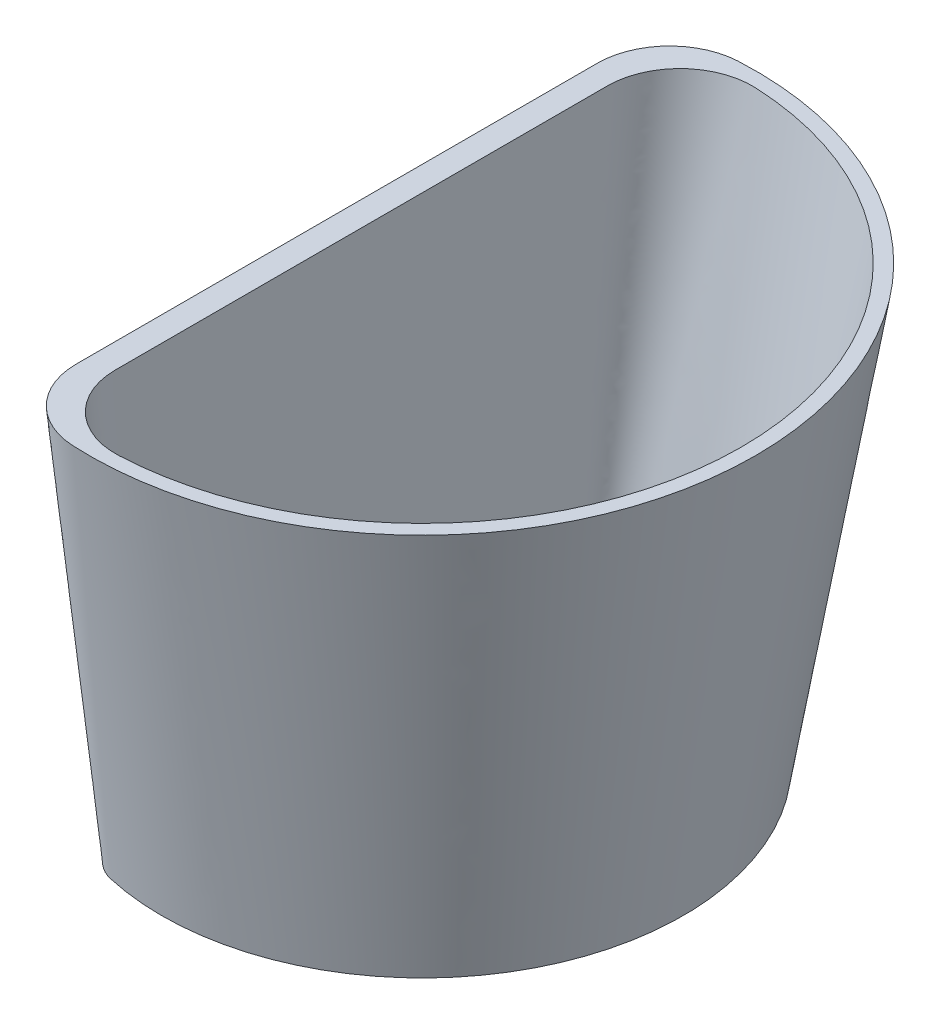
ISO-10303-21;
HEADER;
FILE_DESCRIPTION(('STEP AP214'),'2;1');
FILE_NAME('part.step','',(''),(''),'','','');
FILE_SCHEMA(('AUTOMOTIVE_DESIGN { 1 0 10303 214 1 1 1 1 }'));
ENDSEC;
DATA;
#1=APPLICATION_CONTEXT('core data for automotive mechanical design processes');
#2=APPLICATION_PROTOCOL_DEFINITION('international standard','automotive_design',2000,#1);
#3=PRODUCT_CONTEXT('',#1,'mechanical');
#4=PRODUCT('Part','Part','',(#3));
#5=PRODUCT_RELATED_PRODUCT_CATEGORY('part','',(#4));
#6=PRODUCT_DEFINITION_FORMATION('','',#4);
#7=PRODUCT_DEFINITION_CONTEXT('part definition',#1,'design');
#8=PRODUCT_DEFINITION('design','',#6,#7);
#9=PRODUCT_DEFINITION_SHAPE('','',#8);
#10=(LENGTH_UNIT() NAMED_UNIT(*) SI_UNIT(.MILLI.,.METRE.));
#11=(NAMED_UNIT(*) PLANE_ANGLE_UNIT() SI_UNIT($,.RADIAN.));
#12=(NAMED_UNIT(*) SI_UNIT($,.STERADIAN.) SOLID_ANGLE_UNIT());
#13=UNCERTAINTY_MEASURE_WITH_UNIT(LENGTH_MEASURE(1.E-05),#10,'distance_accuracy_value','');
#14=(GEOMETRIC_REPRESENTATION_CONTEXT(3) GLOBAL_UNCERTAINTY_ASSIGNED_CONTEXT((#13)) GLOBAL_UNIT_ASSIGNED_CONTEXT((#10,
#11,#12)) REPRESENTATION_CONTEXT('',''));
#15=CARTESIAN_POINT('',(0.,0.,0.));
#16=DIRECTION('',(0.,0.,1.));
#17=DIRECTION('',(1.,0.,0.));
#18=AXIS2_PLACEMENT_3D('',#15,#16,#17);
#19=CARTESIAN_POINT('',(44.749368056954,0.,74.8623568739464));
#20=DIRECTION('',(0.,-1.,0.));
#21=DIRECTION('',(0.,0.,-1.));
#22=AXIS2_PLACEMENT_3D('',#19,#20,#21);
#23=PLANE('',#22);
#24=DIRECTION('',(0.,0.,-1.));
#25=VECTOR('',#24,1.);
#26=CARTESIAN_POINT('',(43.1553778499769,0.,74.7241580024169));
#27=LINE('',#26,#25);
#28=CARTESIAN_POINT('',(43.1553778499769,0.,74.7241580024169));
#29=VERTEX_POINT('',#28);
#30=CARTESIAN_POINT('',(43.1553778499769,0.,14.5250534106629));
#31=VERTEX_POINT('',#30);
#32=EDGE_CURVE('E294',#29,#31,#27,.T.);
#33=ORIENTED_EDGE('',*,*,#32,.F.);
#34=CARTESIAN_POINT('',(46.6553778499769,0.,74.7241580024169));
#35=DIRECTION('',(0.,1.,0.));
#36=DIRECTION('',(0.,0.,1.));
#37=AXIS2_PLACEMENT_3D('',#34,#35,#36);
#38=CIRCLE('',#37,3.5);
#39=CARTESIAN_POINT('',(46.0900819743665,0.,78.1782049871897));
#40=VERTEX_POINT('',#39);
#41=EDGE_CURVE('E290',#29,#40,#38,.T.);
#42=ORIENTED_EDGE('',*,*,#41,.T.);
#43=CARTESIAN_POINT('',(51.5815276231532,0.,44.6246057065399));
#44=DIRECTION('',(0.,1.,0.));
#45=DIRECTION('',(0.,0.,1.));
#46=AXIS2_PLACEMENT_3D('',#43,#44,#45);
#47=CIRCLE('',#46,34.);
#48=CARTESIAN_POINT('',(46.0900819743665,0.,11.0710064258901));
#49=VERTEX_POINT('',#48);
#50=EDGE_CURVE('E229',#40,#49,#47,.T.);
#51=ORIENTED_EDGE('',*,*,#50,.T.);
#52=CARTESIAN_POINT('',(46.6553778499769,0.,14.5250534106629));
#53=DIRECTION('',(0.,1.,0.));
#54=DIRECTION('',(0.,0.,1.));
#55=AXIS2_PLACEMENT_3D('',#52,#53,#54);
#56=CIRCLE('',#55,3.5);
#57=EDGE_CURVE('E304',#49,#31,#56,.T.);
#58=ORIENTED_EDGE('',*,*,#57,.T.);
#59=EDGE_LOOP('',(#33,#42,#51,#58));
#60=FACE_BOUND('',#59,.T.);
#61=CARTESIAN_POINT('',(44.749368056954,0.,74.8623568739464));
#62=DIRECTION('',(0.,-1.,0.));
#63=DIRECTION('',(0.,0.,-1.));
#64=AXIS2_PLACEMENT_3D('',#61,#62,#63);
#65=CIRCLE('',#64,4.99999999999999);
#66=CARTESIAN_POINT('',(43.6474068365993,0.,79.7394135138506));
#67=VERTEX_POINT('',#66);
#68=CARTESIAN_POINT('',(39.749368056954,0.,74.8623568740552));
#69=VERTEX_POINT('',#68);
#70=EDGE_CURVE('E470',#67,#69,#65,.T.);
#71=ORIENTED_EDGE('',*,*,#70,.T.);
#72=DIRECTION('',(0.,0.,-1.));
#73=VECTOR('',#72,1.);
#74=CARTESIAN_POINT('',(39.749368056954,0.,74.8623568739464));
#75=LINE('',#74,#73);
#76=CARTESIAN_POINT('',(39.749368056954,0.,14.3868545392133));
#77=VERTEX_POINT('',#76);
#78=EDGE_CURVE('E471',#69,#77,#75,.T.);
#79=ORIENTED_EDGE('',*,*,#78,.T.);
#80=CARTESIAN_POINT('',(44.749368056954,0.,14.3868545391334));
#81=DIRECTION('',(0.,-1.,0.));
#82=DIRECTION('',(0.,0.,-1.));
#83=AXIS2_PLACEMENT_3D('',#80,#81,#82);
#84=CIRCLE('',#83,5.);
#85=CARTESIAN_POINT('',(43.6474068365993,0.,9.50979789922914));
#86=VERTEX_POINT('',#85);
#87=EDGE_CURVE('E235',#77,#86,#84,.T.);
#88=ORIENTED_EDGE('',*,*,#87,.T.);
#89=CARTESIAN_POINT('',(51.5815276231532,0.,44.6246057065399));
#90=DIRECTION('',(0.,1.,0.));
#91=DIRECTION('',(0.,0.,1.));
#92=AXIS2_PLACEMENT_3D('',#89,#90,#91);
#93=CIRCLE('',#92,36.);
#94=EDGE_CURVE('E12',#67,#86,#93,.T.);
#95=ORIENTED_EDGE('',*,*,#94,.F.);
#96=EDGE_LOOP('',(#71,#79,#88,#95));
#97=FACE_BOUND('',#96,.T.);
#98=ADVANCED_FACE('F225',(#60,#97),#23,.T.);
#99=CARTESIAN_POINT('',(49.749368056954,60.,8.671258277907));
#100=DIRECTION('',(0.,-1.,0.));
#101=DIRECTION('',(0.,0.,-1.));
#102=AXIS2_PLACEMENT_3D('',#99,#100,#101);
#103=PLANE('',#102);
#104=CARTESIAN_POINT('',(53.1553778499769,60.,78.5881596351783));
#105=DIRECTION('',(0.,-1.,0.));
#106=DIRECTION('',(0.,0.,-1.));
#107=AXIS2_PLACEMENT_3D('',#104,#105,#106);
#108=CIRCLE('',#107,10.);
#109=CARTESIAN_POINT('',(53.6182749755133,60.,88.5774402024248));
#110=VERTEX_POINT('',#109);
#111=CARTESIAN_POINT('',(43.1553778499769,60.,78.5881596334264));
#112=VERTEX_POINT('',#111);
#113=EDGE_CURVE('E306',#110,#112,#108,.T.);
#114=ORIENTED_EDGE('',*,*,#113,.T.);
#115=DIRECTION('',(0.,0.,-1.));
#116=VECTOR('',#115,1.);
#117=CARTESIAN_POINT('',(43.1553778499769,60.,78.5881596351783));
#118=LINE('',#117,#116);
#119=CARTESIAN_POINT('',(43.1553778499769,60.,10.6610517779015));
#120=VERTEX_POINT('',#119);
#121=EDGE_CURVE('E251',#112,#120,#118,.T.);
#122=ORIENTED_EDGE('',*,*,#121,.T.);
#123=CARTESIAN_POINT('',(53.1553778499769,60.,10.6610517779015));
#124=DIRECTION('',(0.,-1.,0.));
#125=DIRECTION('',(0.,0.,-1.));
#126=AXIS2_PLACEMENT_3D('',#123,#124,#125);
#127=CIRCLE('',#126,10.);
#128=CARTESIAN_POINT('',(53.6182749755133,60.,0.671771210654943));
#129=VERTEX_POINT('',#128);
#130=EDGE_CURVE('E332',#120,#129,#127,.T.);
#131=ORIENTED_EDGE('',*,*,#130,.T.);
#132=CARTESIAN_POINT('',(51.5815276231532,60.,44.6246057065399));
#133=DIRECTION('',(0.,1.,0.));
#134=DIRECTION('',(0.,0.,1.));
#135=AXIS2_PLACEMENT_3D('',#132,#133,#134);
#136=CIRCLE('',#135,44.);
#137=EDGE_CURVE('E322',#110,#129,#136,.T.);
#138=ORIENTED_EDGE('',*,*,#137,.F.);
#139=EDGE_LOOP('',(#114,#122,#131,#138));
#140=FACE_BOUND('',#139,.T.);
#141=CARTESIAN_POINT('',(49.749368056954,60.,8.671258277907));
#142=DIRECTION('',(0.,-1.,0.));
#143=DIRECTION('',(0.,0.,-1.));
#144=AXIS2_PLACEMENT_3D('',#141,#142,#143);
#145=CIRCLE('',#144,9.99999999999999);
#146=CARTESIAN_POINT('',(39.749368056954,60.,8.671258277907));
#147=VERTEX_POINT('',#146);
#148=CARTESIAN_POINT('',(49.2404348441209,60.,-1.31578267449103));
#149=VERTEX_POINT('',#148);
#150=EDGE_CURVE('E509',#147,#149,#145,.T.);
#151=ORIENTED_EDGE('',*,*,#150,.F.);
#152=DIRECTION('',(0.,0.,-1.));
#153=VECTOR('',#152,1.);
#154=CARTESIAN_POINT('',(39.749368056954,60.,80.5779531351728));
#155=LINE('',#154,#153);
#156=CARTESIAN_POINT('',(39.749368056954,60.,80.5779531351728));
#157=VERTEX_POINT('',#156);
#158=EDGE_CURVE('E512',#157,#147,#155,.T.);
#159=ORIENTED_EDGE('',*,*,#158,.F.);
#160=CARTESIAN_POINT('',(49.749368056954,60.,80.5779531351728));
#161=DIRECTION('',(0.,-1.,0.));
#162=DIRECTION('',(0.,0.,-1.));
#163=AXIS2_PLACEMENT_3D('',#160,#161,#162);
#164=CIRCLE('',#163,9.99999999999999);
#165=CARTESIAN_POINT('',(49.2404348441209,60.,90.5649940875708));
#166=VERTEX_POINT('',#165);
#167=EDGE_CURVE('E513',#166,#157,#164,.T.);
#168=ORIENTED_EDGE('',*,*,#167,.F.);
#169=CARTESIAN_POINT('',(51.5815276231532,60.,44.6246057065399));
#170=DIRECTION('',(0.,1.,0.));
#171=DIRECTION('',(0.,0.,1.));
#172=AXIS2_PLACEMENT_3D('',#169,#170,#171);
#173=CIRCLE('',#172,46.);
#174=EDGE_CURVE('E518',#166,#149,#173,.T.);
#175=ORIENTED_EDGE('',*,*,#174,.T.);
#176=EDGE_LOOP('',(#151,#159,#168,#175));
#177=FACE_BOUND('',#176,.T.);
#178=ADVANCED_FACE('F366',(#140,#177),#103,.F.);
#179=CARTESIAN_POINT('',(49.2404348435489,60.,90.5649940875417));
#180=CARTESIAN_POINT('',(43.6474068365757,0.,79.7394135138453));
#181=CARTESIAN_POINT('',(48.7561105621122,60.,90.5403132322433));
#182=CARTESIAN_POINT('',(43.2565458340267,0.,79.651099249903));
#183=CARTESIAN_POINT('',(47.7282801215294,60.0000000000001,90.4180919110948));
#184=CARTESIAN_POINT('',(42.6453440069123,0.,79.4247931599624));
#185=CARTESIAN_POINT('',(46.0213377168144,59.9999999999999,89.9211787568134));
#186=CARTESIAN_POINT('',(41.9152181696053,0.,79.0083870585991));
#187=CARTESIAN_POINT('',(44.2214280972863,60.,89.0016367398177));
#188=CARTESIAN_POINT('',(41.3197873380604,0.,78.5250459439134));
#189=CARTESIAN_POINT('',(42.50979794004,60.,87.5987034523072));
#190=CARTESIAN_POINT('',(40.8175897889531,0.,77.9813587691827));
#191=CARTESIAN_POINT('',(41.1431245125412,59.9999999999999,85.8240149111578));
#192=CARTESIAN_POINT('',(40.4030719002599,0.,77.3697316819144));
#193=CARTESIAN_POINT('',(40.2631184245793,60.0000000000002,83.9379305832855));
#194=CARTESIAN_POINT('',(40.0692853030749,0.,76.6828091592074));
#195=CARTESIAN_POINT('',(39.8240820014068,59.9999999999999,82.1494074261159));
#196=CARTESIAN_POINT('',(39.8307547590165,0.,75.8857100107256));
#197=CARTESIAN_POINT('',(39.749368056954,60.,81.0796759119458));
#198=CARTESIAN_POINT('',(39.749368056954,0.,75.2495310578521));
#199=CARTESIAN_POINT('',(39.749368056954,60.,74.3226066164556));
#200=CARTESIAN_POINT('',(39.749368056954,0.,70.0351718274514));
#201=CARTESIAN_POINT('',(39.749368056954,59.9999999999999,62.2311227569272));
#202=CARTESIAN_POINT('',(39.749368056954,0.,60.0829334843764));
#203=CARTESIAN_POINT('',(39.749368056954,60.0000000000001,44.6246057065399));
#204=CARTESIAN_POINT('',(39.749368056954,0.,44.6246057065398));
#205=CARTESIAN_POINT('',(39.749368056954,59.9999999999999,27.0180886561525));
#206=CARTESIAN_POINT('',(39.749368056954,0.,29.1662779287035));
#207=CARTESIAN_POINT('',(39.749368056954,60.,14.9266047966242));
#208=CARTESIAN_POINT('',(39.749368056954,0.,19.2140395856284));
#209=CARTESIAN_POINT('',(39.749368056954,60.,8.16953550113402));
#210=CARTESIAN_POINT('',(39.749368056954,0.,13.9996803552277));
#211=CARTESIAN_POINT('',(39.8240820014068,60.0000000000001,7.09980398696377));
#212=CARTESIAN_POINT('',(39.8307547590163,0.,13.3635014023542));
#213=CARTESIAN_POINT('',(40.2631184245792,59.9999999999999,5.31128082979441));
#214=CARTESIAN_POINT('',(40.0692853030751,0.,12.5664022538724));
#215=CARTESIAN_POINT('',(41.1431245125411,60.0000000000001,3.4251965019218));
#216=CARTESIAN_POINT('',(40.4030719002597,0.,11.8794797311654));
#217=CARTESIAN_POINT('',(42.50979794004,59.9999999999999,1.65050796077274));
#218=CARTESIAN_POINT('',(40.8175897889532,0.,11.2678526438971));
#219=CARTESIAN_POINT('',(44.2214280972862,60.0000000000001,0.247574673261975));
#220=CARTESIAN_POINT('',(41.3197873380603,0.,10.7241654691665));
#221=CARTESIAN_POINT('',(46.0213377168144,60.,-0.671967343733635));
#222=CARTESIAN_POINT('',(41.9152181696054,0.,10.2408243544805));
#223=CARTESIAN_POINT('',(47.7282801215294,60.,-1.16888049801498));
#224=CARTESIAN_POINT('',(42.6453440069123,0.,9.82441825311737));
#225=CARTESIAN_POINT('',(48.7561105621122,60.,-1.29110181916355));
#226=CARTESIAN_POINT('',(43.2565458340267,0.,9.59811216317674));
#227=CARTESIAN_POINT('',(52.4187568279479,60.,-1.47774792789863));
#228=CARTESIAN_POINT('',(46.2123868816821,0.,8.93024577397015));
#229=CARTESIAN_POINT('',(58.7793915852483,59.9999999999998,-1.1386771694054));
#230=CARTESIAN_POINT('',(51.491190258703,0.,8.33065012224513));
#231=CARTESIAN_POINT('',(67.9422237635226,60.0000000000002,1.28907874867168));
#232=CARTESIAN_POINT('',(59.4728063410262,0.,9.19473079903732));
#233=CARTESIAN_POINT('',(76.365812201963,59.9999999999999,5.4962452444191));
#234=CARTESIAN_POINT('',(67.1160409031732,0.,11.8147697763951));
#235=CARTESIAN_POINT('',(83.7276505707123,60.,11.2835223665123));
#236=CARTESIAN_POINT('',(74.0249264872216,0.,16.0884124117868));
#237=CARTESIAN_POINT('',(89.7523543690454,60.0000000000002,18.3991910431506));
#238=CARTESIAN_POINT('',(79.8326699345792,0.,21.8197115931579));
#239=CARTESIAN_POINT('',(94.218523181317,59.9999999999998,26.5492773582945));
#240=CARTESIAN_POINT('',(84.2253219453773,0.,28.7281531570384));
#241=CARTESIAN_POINT('',(96.9641043979797,60.0000000000001,35.4072096181944));
#242=CARTESIAN_POINT('',(86.9620135937545,0.,36.4632168400816));
#243=CARTESIAN_POINT('',(97.890396688189,59.9999999999999,44.62460570654));
#244=CARTESIAN_POINT('',(87.8915127845235,0.,44.6246057065399));
#245=CARTESIAN_POINT('',(96.9641043979798,60.0000000000002,53.8420017948851));
#246=CARTESIAN_POINT('',(86.9620135937543,0.,52.7859945729984));
#247=CARTESIAN_POINT('',(94.2185231813167,59.9999999999999,62.6999340547856));
#248=CARTESIAN_POINT('',(84.2253219453776,0.,60.5210582560413));
#249=CARTESIAN_POINT('',(89.7523543690455,60.0000000000001,70.850020369929));
#250=CARTESIAN_POINT('',(79.8326699345792,0.,67.4294998199223));
#251=CARTESIAN_POINT('',(83.7276505707123,60.,77.9656890465679));
#252=CARTESIAN_POINT('',(74.0249264872213,0.,73.1607990012928));
#253=CARTESIAN_POINT('',(76.3658122019629,60.,83.7529661686604));
#254=CARTESIAN_POINT('',(67.1160409031731,0.,77.4344416366851));
#255=CARTESIAN_POINT('',(67.9422237635225,60.0000000000001,87.9601326644082));
#256=CARTESIAN_POINT('',(59.4728063410262,0.,80.0544806140422));
#257=CARTESIAN_POINT('',(58.7793915852481,60.,90.3878885824852));
#258=CARTESIAN_POINT('',(51.4911902587028,0.,80.9185612908349));
#259=CARTESIAN_POINT('',(52.4187568279479,60.,90.7269593409784));
#260=CARTESIAN_POINT('',(46.2123868816821,0.,80.3189656391096));
#261=CARTESIAN_POINT('',(49.2404348435489,60.,90.5649940875417));
#262=CARTESIAN_POINT('',(43.6474068365757,0.,79.7394135138453));
#263=B_SPLINE_SURFACE_WITH_KNOTS('',3,1,((#179,#180),(#181,#182),(#183,#184),(#185,#186),(#187,
#188),(#189,#190),(#191,#192),(#193,#194),(#195,#196),(#197,#198),(#199,#200),(#201,#202),(#203,
#204),(#205,#206),(#207,#208),(#209,#210),(#211,#212),(#213,#214),(#215,#216),(#217,#218),(#219,
#220),(#221,#222),(#223,#224),(#225,#226),(#227,#228),(#229,#230),(#231,#232),(#233,#234),(#235,
#236),(#237,#238),(#239,#240),(#241,#242),(#243,#244),(#245,#246),(#247,#248),(#249,#250),(#251,
#252),(#253,#254),(#255,#256),(#257,#258),(#259,#260),(#261,#262)),.UNSPECIFIED.,.T.,.F.,.F.,(4,
1,1,1,1,1,1,1,2,1,1,1,2,1,1,1,1,1,1,1,2,1,1,1,1,1,1,1,1,1,1,1,1,1,1,1,4),(2,2),(0.,
0.00585243374808352,0.011704867496167,0.0175573012442506,0.0234097349923341,0.0292621687404176,
0.0351146024885011,0.0409670362365847,0.0468194699846682,0.119786061295068,0.192752652605468,
0.265719243915867,0.338685835226267,0.344538268974351,0.350390702722434,0.356243136470518,
0.362095570218601,0.367948003966685,0.373800437714768,0.379652871462852,0.385505305210935,
0.423911223635252,0.462317142059568,0.500723060483885,0.539128978908201,0.577534897332518,
0.615940815756834,0.654346734181151,0.692752652605468,0.731158571029784,0.769564489454101,
0.807970407878417,0.846376326302734,0.88478224472705,0.923188163151367,0.961594081575683,1.),
(0.,1.),.UNSPECIFIED.);
#264=CARTESIAN_POINT('',(39.749368056954,60.,44.6246057065399));
#265=CARTESIAN_POINT('',(39.749368056954,0.,44.6246057065399));
#266=CARTESIAN_POINT('',(39.749368056954,60.,38.7557666897441));
#267=CARTESIAN_POINT('',(39.749368056954,0.,39.4718297805944));
#268=CARTESIAN_POINT('',(39.749368056954,59.9999999999999,27.0180886561525));
#269=CARTESIAN_POINT('',(39.749368056954,0.,29.1662779287035));
#270=CARTESIAN_POINT('',(39.749368056954,60.,14.9266047966242));
#271=CARTESIAN_POINT('',(39.749368056954,0.,19.2140395856284));
#272=CARTESIAN_POINT('',(39.749368056954,60.,8.16953550113402));
#273=CARTESIAN_POINT('',(39.749368056954,0.,13.9996803552277));
#274=CARTESIAN_POINT('',(39.8240820014068,60.0000000000001,7.09980398696377));
#275=CARTESIAN_POINT('',(39.8307547590163,0.,13.3635014023542));
#276=CARTESIAN_POINT('',(40.2631184245792,59.9999999999999,5.31128082979441));
#277=CARTESIAN_POINT('',(40.0692853030751,0.,12.5664022538724));
#278=CARTESIAN_POINT('',(41.1431245125411,60.0000000000001,3.4251965019218));
#279=CARTESIAN_POINT('',(40.4030719002597,0.,11.8794797311654));
#280=CARTESIAN_POINT('',(42.50979794004,59.9999999999999,1.65050796077274));
#281=CARTESIAN_POINT('',(40.8175897889532,0.,11.2678526438971));
#282=CARTESIAN_POINT('',(44.2214280972862,60.0000000000001,0.247574673261975));
#283=CARTESIAN_POINT('',(41.3197873380603,0.,10.7241654691665));
#284=CARTESIAN_POINT('',(46.0213377168144,60.,-0.671967343733635));
#285=CARTESIAN_POINT('',(41.9152181696054,0.,10.2408243544805));
#286=CARTESIAN_POINT('',(47.7282801215294,60.,-1.16888049801498));
#287=CARTESIAN_POINT('',(42.6453440069123,0.,9.82441825311737));
#288=CARTESIAN_POINT('',(48.7561105621122,60.,-1.29110181916355));
#289=CARTESIAN_POINT('',(43.2565458340267,0.,9.59811216317674));
#290=CARTESIAN_POINT('',(52.4187568279479,60.,-1.47774792789863));
#291=CARTESIAN_POINT('',(46.2123868816821,0.,8.93024577397015));
#292=CARTESIAN_POINT('',(58.7793915852483,59.9999999999998,-1.1386771694054));
#293=CARTESIAN_POINT('',(51.491190258703,0.,8.33065012224513));
#294=CARTESIAN_POINT('',(67.9422237635226,60.0000000000002,1.28907874867168));
#295=CARTESIAN_POINT('',(59.4728063410262,0.,9.19473079903732));
#296=CARTESIAN_POINT('',(76.365812201963,59.9999999999999,5.4962452444191));
#297=CARTESIAN_POINT('',(67.1160409031732,0.,11.8147697763951));
#298=CARTESIAN_POINT('',(83.7276505707123,60.,11.2835223665123));
#299=CARTESIAN_POINT('',(74.0249264872216,0.,16.0884124117868));
#300=CARTESIAN_POINT('',(89.7523543690454,60.0000000000002,18.3991910431506));
#301=CARTESIAN_POINT('',(79.8326699345792,0.,21.8197115931579));
#302=CARTESIAN_POINT('',(94.218523181317,59.9999999999998,26.5492773582945));
#303=CARTESIAN_POINT('',(84.2253219453773,0.,28.7281531570384));
#304=CARTESIAN_POINT('',(96.9641043979797,60.0000000000001,35.4072096181944));
#305=CARTESIAN_POINT('',(86.9620135937545,0.,36.4632168400816));
#306=CARTESIAN_POINT('',(97.890396688189,59.9999999999999,44.62460570654));
#307=CARTESIAN_POINT('',(87.8915127845235,0.,44.6246057065399));
#308=CARTESIAN_POINT('',(96.9641043979798,60.0000000000002,53.8420017948851));
#309=CARTESIAN_POINT('',(86.9620135937543,0.,52.7859945729984));
#310=CARTESIAN_POINT('',(94.2185231813167,59.9999999999999,62.6999340547856));
#311=CARTESIAN_POINT('',(84.2253219453776,0.,60.5210582560413));
#312=CARTESIAN_POINT('',(89.7523543690455,60.0000000000001,70.850020369929));
#313=CARTESIAN_POINT('',(79.8326699345792,0.,67.4294998199223));
#314=CARTESIAN_POINT('',(83.7276505707123,60.,77.9656890465679));
#315=CARTESIAN_POINT('',(74.0249264872213,0.,73.1607990012928));
#316=CARTESIAN_POINT('',(76.3658122019629,60.,83.7529661686604));
#317=CARTESIAN_POINT('',(67.1160409031731,0.,77.4344416366851));
#318=CARTESIAN_POINT('',(67.9422237635225,60.0000000000001,87.9601326644082));
#319=CARTESIAN_POINT('',(59.4728063410262,0.,80.0544806140422));
#320=CARTESIAN_POINT('',(58.7793915852481,60.,90.3878885824852));
#321=CARTESIAN_POINT('',(51.4911902587028,0.,80.9185612908349));
#322=CARTESIAN_POINT('',(52.4187568279479,60.,90.7269593409784));
#323=CARTESIAN_POINT('',(46.2123868816821,0.,80.3189656391096));
#324=CARTESIAN_POINT('',(48.7561105621122,60.,90.5403132322433));
#325=CARTESIAN_POINT('',(43.2565458340267,0.,79.651099249903));
#326=CARTESIAN_POINT('',(47.7282801215294,60.0000000000001,90.4180919110948));
#327=CARTESIAN_POINT('',(42.6453440069123,0.,79.4247931599624));
#328=CARTESIAN_POINT('',(46.0213377168144,59.9999999999999,89.9211787568134));
#329=CARTESIAN_POINT('',(41.9152181696053,0.,79.0083870585991));
#330=CARTESIAN_POINT('',(44.2214280972863,60.,89.0016367398177));
#331=CARTESIAN_POINT('',(41.3197873380604,0.,78.5250459439134));
#332=CARTESIAN_POINT('',(42.50979794004,60.,87.5987034523072));
#333=CARTESIAN_POINT('',(40.8175897889531,0.,77.9813587691827));
#334=CARTESIAN_POINT('',(41.1431245125412,59.9999999999999,85.8240149111578));
#335=CARTESIAN_POINT('',(40.4030719002599,0.,77.3697316819144));
#336=CARTESIAN_POINT('',(40.2631184245793,60.0000000000002,83.9379305832855));
#337=CARTESIAN_POINT('',(40.0692853030749,0.,76.6828091592074));
#338=CARTESIAN_POINT('',(39.8240820014068,59.9999999999999,82.1494074261159));
#339=CARTESIAN_POINT('',(39.8307547590165,0.,75.8857100107256));
#340=CARTESIAN_POINT('',(39.749368056954,60.,81.0796759119458));
#341=CARTESIAN_POINT('',(39.749368056954,0.,75.2495310578521));
#342=CARTESIAN_POINT('',(39.749368056954,60.,74.3226066164556));
#343=CARTESIAN_POINT('',(39.749368056954,0.,70.0351718274514));
#344=CARTESIAN_POINT('',(39.749368056954,59.9999999999999,62.2311227569272));
#345=CARTESIAN_POINT('',(39.749368056954,0.,60.0829334843764));
#346=CARTESIAN_POINT('',(39.749368056954,60.,50.4934447233357));
#347=CARTESIAN_POINT('',(39.749368056954,0.,49.7773816324854));
#348=CARTESIAN_POINT('',(39.749368056954,60.,44.6246057065399));
#349=CARTESIAN_POINT('',(39.749368056954,0.,44.6246057065399));
#350=B_SPLINE_SURFACE_WITH_KNOTS('',3,1,((#264,#265),(#266,#267),(#268,#269),(#270,#271),(#272,
#273),(#274,#275),(#276,#277),(#278,#279),(#280,#281),(#282,#283),(#284,#285),(#286,#287),(#288,
#289),(#290,#291),(#292,#293),(#294,#295),(#296,#297),(#298,#299),(#300,#301),(#302,#303),(#304,
#305),(#306,#307),(#308,#309),(#310,#311),(#312,#313),(#314,#315),(#316,#317),(#318,#319),(#320,
#321),(#322,#323),(#324,#325),(#326,#327),(#328,#329),(#330,#331),(#332,#333),(#334,#335),(#336,
#337),(#338,#339),(#340,#341),(#342,#343),(#344,#345),(#346,#347),(#348,#349)),.UNSPECIFIED.,
.T.,.F.,.F.,(4,1,2,1,1,1,1,1,1,1,2,1,1,1,1,1,1,1,1,1,1,1,1,1,1,1,2,1,1,1,1,1,1,1,2,1,4),(2,2),
(0.192752652605468,0.265719243915867,0.338685835226267,0.344538268974351,0.350390702722434,
0.356243136470518,0.362095570218601,0.367948003966685,0.373800437714768,0.379652871462852,
0.385505305210935,0.423911223635252,0.462317142059568,0.500723060483885,0.539128978908201,
0.577534897332518,0.615940815756834,0.654346734181151,0.692752652605468,0.731158571029784,
0.769564489454101,0.807970407878417,0.846376326302734,0.88478224472705,0.923188163151367,
0.961594081575683,1.,1.00585243374808,1.01170486749617,1.01755730124425,1.02340973499233,
1.02926216874042,1.0351146024885,1.04096703623658,1.04681946998467,1.11978606129507,
1.19275265260547),(0.,1.),.UNSPECIFIED.);
#351=ORIENTED_EDGE('',*,*,#158,.T.);
#352=ORIENTED_EDGE('',*,*,#150,.T.);
#353=ORIENTED_EDGE('',*,*,#174,.F.);
#354=ORIENTED_EDGE('',*,*,#167,.T.);
#355=EDGE_LOOP('',(#351,#352,#353,#354));
#356=FACE_BOUND('',#355,.T.);
#357=ORIENTED_EDGE('',*,*,#94,.T.);
#358=ORIENTED_EDGE('',*,*,#87,.F.);
#359=ORIENTED_EDGE('',*,*,#78,.F.);
#360=ORIENTED_EDGE('',*,*,#70,.F.);
#361=EDGE_LOOP('',(#357,#358,#359,#360));
#362=FACE_BOUND('',#361,.T.);
#363=ADVANCED_FACE('F375',(#356,#362),#350,.T.);
#364=CARTESIAN_POINT('',(43.1553778499769,0.,74.724158000997));
#365=CARTESIAN_POINT('',(43.1553778499769,60.,78.5881596334264));
#366=CARTESIAN_POINT('',(43.1553778499769,0.,74.9073264431763));
#367=CARTESIAN_POINT('',(43.1553778499769,60.,78.8246763681193));
#368=CARTESIAN_POINT('',(43.1804630956606,0.,75.1904703316875));
#369=CARTESIAN_POINT('',(43.1720122359098,60.,79.3169817673799));
#370=CARTESIAN_POINT('',(43.2461051011787,0.,75.5402678286979));
#371=CARTESIAN_POINT('',(43.2618319216803,60.,80.1175369569622));
#372=CARTESIAN_POINT('',(43.33326132028,0.,75.8381123185173));
#373=CARTESIAN_POINT('',(43.4314846633945,60.,80.9844705277916));
#374=CARTESIAN_POINT('',(43.4358397146153,0.,76.106730659086));
#375=CARTESIAN_POINT('',(43.7070481163939,60.0000000000001,81.915933119006));
#376=CARTESIAN_POINT('',(43.5527507428362,0.,76.3509205706662));
#377=CARTESIAN_POINT('',(44.1145999360204,60.,82.9100753697434));
#378=CARTESIAN_POINT('',(43.682538963989,0.,76.5774677646432));
#379=CARTESIAN_POINT('',(44.6755864740628,59.9999999999999,83.9350916324017));
#380=CARTESIAN_POINT('',(43.8252724756179,0.,76.7884907483848));
#381=CARTESIAN_POINT('',(45.4114540823105,60.,84.9591762593785));
#382=CARTESIAN_POINT('',(43.9809683166051,0.,76.9866595477743));
#383=CARTESIAN_POINT('',(46.3037925495351,60.,85.91097724885));
#384=CARTESIAN_POINT('',(44.1506513366365,0.,77.1730988161088));
#385=CARTESIAN_POINT('',(47.3055233311094,60.,86.7320292136162));
#386=CARTESIAN_POINT('',(44.3352493765186,0.,77.3489698535089));
#387=CARTESIAN_POINT('',(48.353002153699,60.,87.3861992181831));
#388=CARTESIAN_POINT('',(44.5375137540486,0.,77.5147293160264));
#389=CARTESIAN_POINT('',(49.3811479986483,60.,87.869801313638));
#390=CARTESIAN_POINT('',(44.7594339047097,0.,77.6707936050647));
#391=CARTESIAN_POINT('',(50.3652548129912,60.,88.2077547089654));
#392=CARTESIAN_POINT('',(45.0084009633765,0.,77.8168292118398));
#393=CARTESIAN_POINT('',(51.2806165437617,60.,88.42497861315));
#394=CARTESIAN_POINT('',(45.2887323452086,0.,77.9526184404155));
#395=CARTESIAN_POINT('',(52.1282002505839,60.,88.5457967700311));
#396=CARTESIAN_POINT('',(45.6262893593501,0.,78.0757662907179));
#397=CARTESIAN_POINT('',(52.9089729930819,60.,88.5945329234477));
#398=CARTESIAN_POINT('',(45.9044298113751,0.,78.147820802348));
#399=CARTESIAN_POINT('',(53.3881851943536,60.,88.5881024215503));
#400=CARTESIAN_POINT('',(48.4286671843198,0.,78.5609422747188));
#401=CARTESIAN_POINT('',(56.5166228950211,60.,88.443132540155));
#402=CARTESIAN_POINT('',(53.216176778338,0.,78.8405530997279));
#403=CARTESIAN_POINT('',(62.2429636066867,59.9999999999999,87.6019870297489));
#404=CARTESIAN_POINT('',(60.4074430282384,0.,77.7286517073031));
#405=CARTESIAN_POINT('',(70.3219954961118,60.0000000000001,84.7362332410769));
#406=CARTESIAN_POINT('',(67.2673619730501,0.,75.08879215654));
#407=CARTESIAN_POINT('',(77.6248209408697,59.9999999999999,80.4218313204565));
#408=CARTESIAN_POINT('',(73.4551991047659,0.,71.0052381301322));
#409=CARTESIAN_POINT('',(83.9215047459774,60.0000000000001,74.8480935293559));
#410=CARTESIAN_POINT('',(78.6515445576694,0.,65.644550703047));
#411=CARTESIAN_POINT('',(89.0209035914348,59.9999999999999,68.2329981301244));
#412=CARTESIAN_POINT('',(81.9253746264567,0.,60.3149923040616));
#413=CARTESIAN_POINT('',(92.1469817768663,60.0000000000001,62.0531153191198));
#414=CARTESIAN_POINT('',(83.8038554789695,0.,55.6870650191736));
#415=CARTESIAN_POINT('',(93.9195392772716,59.9999999999998,56.8376158881366));
#416=CARTESIAN_POINT('',(85.1660897889459,0.,50.8749754628255));
#417=CARTESIAN_POINT('',(95.1954709331666,60.0000000000003,51.485833011448));
#418=CARTESIAN_POINT('',(85.8586871450506,0.,44.6246057065398));
#419=CARTESIAN_POINT('',(95.8390136745548,59.9999999999997,44.6246057065397));
#420=CARTESIAN_POINT('',(85.1660897889461,0.,38.3742359502545));
#421=CARTESIAN_POINT('',(95.1954709331666,60.0000000000002,37.7633784016322));
#422=CARTESIAN_POINT('',(83.8038554789696,0.,33.5621463939063));
#423=CARTESIAN_POINT('',(93.9195392772717,59.9999999999998,32.4115955249431));
#424=CARTESIAN_POINT('',(81.9253746264566,0.,28.9342191090182));
#425=CARTESIAN_POINT('',(92.1469817768663,60.0000000000003,27.1960960939602));
#426=CARTESIAN_POINT('',(78.6515445576697,0.,23.6046607100329));
#427=CARTESIAN_POINT('',(89.0209035914347,59.9999999999996,21.0162132829555));
#428=CARTESIAN_POINT('',(73.4551991047658,0.,18.2439732829476));
#429=CARTESIAN_POINT('',(83.9215047459776,60.0000000000002,14.4011178837236));
#430=CARTESIAN_POINT('',(67.2673619730505,0.,14.1604192565399));
#431=CARTESIAN_POINT('',(77.6248209408696,59.9999999999998,8.82738009262346));
#432=CARTESIAN_POINT('',(60.4074430282382,0.,11.5205597057767));
#433=CARTESIAN_POINT('',(70.3219954961118,60.0000000000002,4.51297817200288));
#434=CARTESIAN_POINT('',(53.2161767783383,0.,10.4086583133518));
#435=CARTESIAN_POINT('',(62.2429636066867,59.9999999999998,1.64722438333091));
#436=CARTESIAN_POINT('',(48.4286671843199,0.,10.688269138361));
#437=CARTESIAN_POINT('',(56.5166228950211,60.,0.806078872924806));
#438=CARTESIAN_POINT('',(45.9044298113751,0.,11.1013906107318));
#439=CARTESIAN_POINT('',(53.3881851943535,60.,0.661108991529439));
#440=CARTESIAN_POINT('',(45.6262893593501,0.,11.1734451223619));
#441=CARTESIAN_POINT('',(52.9089729930818,60.,0.654678489632064));
#442=CARTESIAN_POINT('',(45.2887323452084,0.,11.2965929726644));
#443=CARTESIAN_POINT('',(52.1282002505837,60.,0.703414643048667));
#444=CARTESIAN_POINT('',(45.0084009633766,0.,11.4323822012399));
#445=CARTESIAN_POINT('',(51.2806165437617,60.,0.824232799929703));
#446=CARTESIAN_POINT('',(44.7594339047095,0.,11.5784178080153));
#447=CARTESIAN_POINT('',(50.3652548129914,60.,1.04145670411436));
#448=CARTESIAN_POINT('',(44.5375137540487,0.,11.7344820970531));
#449=CARTESIAN_POINT('',(49.3811479986482,60.,1.37941009944183));
#450=CARTESIAN_POINT('',(44.3352493765185,0.,11.9002415595712));
#451=CARTESIAN_POINT('',(48.3530021536988,60.,1.86301219489673));
#452=CARTESIAN_POINT('',(44.1506513366365,0.,12.0761125969708));
#453=CARTESIAN_POINT('',(47.3055233311096,60.,2.51718219946366));
#454=CARTESIAN_POINT('',(43.9809683166052,0.,12.2625518653057));
#455=CARTESIAN_POINT('',(46.3037925495349,60.0000000000001,3.33823416422968));
#456=CARTESIAN_POINT('',(43.8252724756178,0.,12.4607206646949));
#457=CARTESIAN_POINT('',(45.4114540823106,59.9999999999998,4.29003515370148));
#458=CARTESIAN_POINT('',(43.6825389639891,0.,12.6717436484366));
#459=CARTESIAN_POINT('',(44.6755864740627,60.0000000000001,5.3141197806779));
#460=CARTESIAN_POINT('',(43.5527507428362,0.,12.8982908424135));
#461=CARTESIAN_POINT('',(44.1145999360203,60.,6.33913604333631));
#462=CARTESIAN_POINT('',(43.4358397146153,0.,13.1424807539939));
#463=CARTESIAN_POINT('',(43.707048116394,59.9999999999999,7.33327829407399));
#464=CARTESIAN_POINT('',(43.3332613202799,0.,13.4110990945624));
#465=CARTESIAN_POINT('',(43.4314846633945,60.,8.26474088528825));
#466=CARTESIAN_POINT('',(43.2461051011788,0.,13.708943584382));
#467=CARTESIAN_POINT('',(43.2618319216802,60.0000000000001,9.1316744561174));
#468=CARTESIAN_POINT('',(43.1804630956605,0.,14.0587410813922));
#469=CARTESIAN_POINT('',(43.1720122359097,60.,9.93222964569979));
#470=CARTESIAN_POINT('',(43.1553778499769,0.,14.3418849699035));
#471=CARTESIAN_POINT('',(43.1553778499769,60.,10.4245350449605));
#472=CARTESIAN_POINT('',(43.1553778499769,0.,19.2198053741171));
#473=CARTESIAN_POINT('',(43.1553778499769,60.,16.7231626489844));
#474=CARTESIAN_POINT('',(43.1553778499769,0.,29.0429511385028));
#475=CARTESIAN_POINT('',(43.1553778499768,60.,28.1862311359012));
#476=CARTESIAN_POINT('',(43.1553778499769,0.,44.6246057065399));
#477=CARTESIAN_POINT('',(43.155377849977,60.,44.6246057065399));
#478=CARTESIAN_POINT('',(43.1553778499769,0.,60.2062602745769));
#479=CARTESIAN_POINT('',(43.1553778499769,60.,61.0629802771786));
#480=CARTESIAN_POINT('',(43.1553778499769,0.,70.0294060389627));
#481=CARTESIAN_POINT('',(43.1553778499769,60.,72.5260487640954));
#482=CARTESIAN_POINT('',(43.1553778499769,0.,74.724158000997));
#483=CARTESIAN_POINT('',(43.1553778499769,60.,78.5881596334264));
#484=B_SPLINE_SURFACE_WITH_KNOTS('',3,1,((#364,#365),(#366,#367),(#368,#369),(#370,#371),(#372,
#373),(#374,#375),(#376,#377),(#378,#379),(#380,#381),(#382,#383),(#384,#385),(#386,#387),(#388,
#389),(#390,#391),(#392,#393),(#394,#395),(#396,#397),(#398,#399),(#400,#401),(#402,#403),(#404,
#405),(#406,#407),(#408,#409),(#410,#411),(#412,#413),(#414,#415),(#416,#417),(#418,#419),(#420,
#421),(#422,#423),(#424,#425),(#426,#427),(#428,#429),(#430,#431),(#432,#433),(#434,#435),(#436,
#437),(#438,#439),(#440,#441),(#442,#443),(#444,#445),(#446,#447),(#448,#449),(#450,#451),(#452,
#453),(#454,#455),(#456,#457),(#458,#459),(#460,#461),(#462,#463),(#464,#465),(#466,#467),(#468,
#469),(#470,#471),(#472,#473),(#474,#475),(#476,#477),(#478,#479),(#480,#481),(#482,#483)),
.UNSPECIFIED.,.T.,.F.,.F.,(4,1,1,1,1,1,1,1,1,1,1,1,1,1,1,1,2,1,1,1,1,1,1,1,1,1,1,1,1,1,1,1,1,1,
2,1,1,1,1,1,1,1,1,1,1,1,1,1,1,1,2,1,1,1,4),(2,2),(0.,0.00297558215630201,0.00595116431260403,
0.00892674646890605,0.0119023286252081,0.0148779107815101,0.0178534929378121,0.0208290750941141,
0.0238046572504161,0.0267802394067181,0.0297558215630202,0.0327314037193222,0.0357069858756242,
0.0386825680319262,0.0416581501882282,0.0446337323445302,0.0476093145008322,0.0850915194953442,
0.122573724489856,0.160055929484368,0.19753813447888,0.235020339473392,0.272502544467904,
0.29124364696516,0.309984749462416,0.347466954456928,0.38494915945144,0.403690261948696,
0.422431364445952,0.459913569440464,0.497395774434976,0.534877979429488,0.572360184423999,
0.609842389418512,0.647324594413023,0.650300176569325,0.653275758725627,0.656251340881929,
0.659226923038232,0.662202505194534,0.665178087350836,0.668153669507138,0.67112925166344,
0.674104833819742,0.677080415976044,0.680055998132346,0.683031580288648,0.68600716244495,
0.688982744601252,0.691958326757554,0.694933908913856,0.771200431685392,0.847466954456928,
0.923733477228464,1.),(0.,1.),.UNSPECIFIED.);
#485=ORIENTED_EDGE('',*,*,#41,.F.);
#486=ORIENTED_EDGE('',*,*,#32,.T.);
#487=ORIENTED_EDGE('',*,*,#57,.F.);
#488=ORIENTED_EDGE('',*,*,#50,.F.);
#489=EDGE_LOOP('',(#485,#486,#487,#488));
#490=FACE_BOUND('',#489,.T.);
#491=ORIENTED_EDGE('',*,*,#113,.F.);
#492=ORIENTED_EDGE('',*,*,#137,.T.);
#493=ORIENTED_EDGE('',*,*,#130,.F.);
#494=ORIENTED_EDGE('',*,*,#121,.F.);
#495=EDGE_LOOP('',(#491,#492,#493,#494));
#496=FACE_BOUND('',#495,.T.);
#497=ADVANCED_FACE('F293',(#490,#496),#484,.F.);
#498=CLOSED_SHELL('',(#98,#178,#363,#497));
#499=MANIFOLD_SOLID_BREP('B2',#498);
#500=ADVANCED_BREP_SHAPE_REPRESENTATION('',(#18,#499),#14);
#501=SHAPE_DEFINITION_REPRESENTATION(#9,#500);
ENDSEC;
END-ISO-10303-21;
